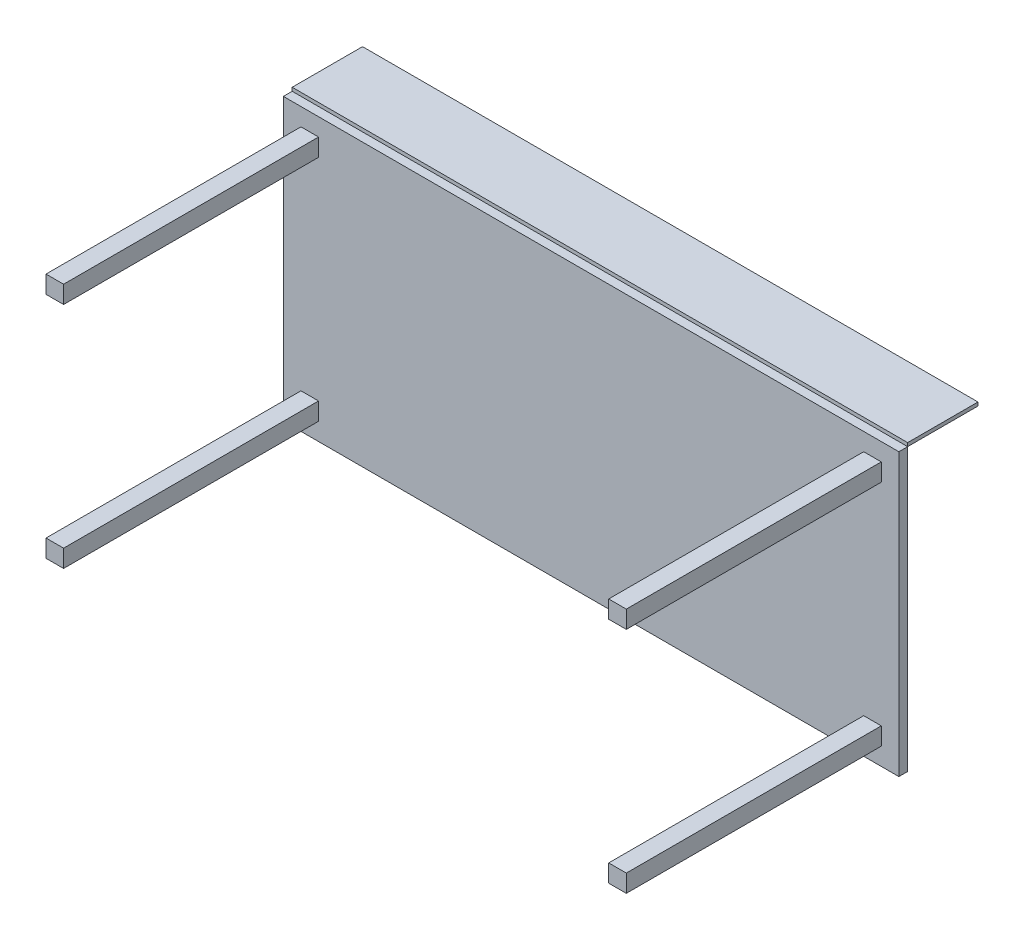
ISO-10303-21;
HEADER;
FILE_DESCRIPTION(('STEP AP214'),'2;1');
FILE_NAME('part.step','',(''),(''),'','','');
FILE_SCHEMA(('AUTOMOTIVE_DESIGN { 1 0 10303 214 1 1 1 1 }'));
ENDSEC;
DATA;
#1=APPLICATION_CONTEXT('core data for automotive mechanical design processes');
#2=APPLICATION_PROTOCOL_DEFINITION('international standard','automotive_design',2000,#1);
#3=PRODUCT_CONTEXT('',#1,'mechanical');
#4=PRODUCT('Part','Part','',(#3));
#5=PRODUCT_RELATED_PRODUCT_CATEGORY('part','',(#4));
#6=PRODUCT_DEFINITION_FORMATION('','',#4);
#7=PRODUCT_DEFINITION_CONTEXT('part definition',#1,'design');
#8=PRODUCT_DEFINITION('design','',#6,#7);
#9=PRODUCT_DEFINITION_SHAPE('','',#8);
#10=(LENGTH_UNIT() NAMED_UNIT(*) SI_UNIT(.MILLI.,.METRE.));
#11=(NAMED_UNIT(*) PLANE_ANGLE_UNIT() SI_UNIT($,.RADIAN.));
#12=(NAMED_UNIT(*) SI_UNIT($,.STERADIAN.) SOLID_ANGLE_UNIT());
#13=UNCERTAINTY_MEASURE_WITH_UNIT(LENGTH_MEASURE(1.E-05),#10,'distance_accuracy_value','');
#14=(GEOMETRIC_REPRESENTATION_CONTEXT(3) GLOBAL_UNCERTAINTY_ASSIGNED_CONTEXT((#13)) GLOBAL_UNIT_ASSIGNED_CONTEXT((#10,
#11,#12)) REPRESENTATION_CONTEXT('',''));
#15=CARTESIAN_POINT('',(0.,0.,0.));
#16=DIRECTION('',(0.,0.,1.));
#17=DIRECTION('',(1.,0.,0.));
#18=AXIS2_PLACEMENT_3D('',#15,#16,#17);
#19=CARTESIAN_POINT('',(778.582583501002,-333.432325570584,0.));
#20=DIRECTION('',(0.,0.,1.));
#21=DIRECTION('',(1.,0.,0.));
#22=AXIS2_PLACEMENT_3D('',#19,#20,#21);
#23=PLANE('',#22);
#24=DIRECTION('',(1.,0.,0.));
#25=VECTOR('',#24,1.);
#26=CARTESIAN_POINT('',(-96.4174164989983,66.5676744294162,0.));
#27=LINE('',#26,#25);
#28=CARTESIAN_POINT('',(-96.4174164989983,66.5676744294162,0.));
#29=VERTEX_POINT('',#28);
#30=CARTESIAN_POINT('',(1653.582583501,66.5676744294162,0.));
#31=VERTEX_POINT('',#30);
#32=EDGE_CURVE('E290',#29,#31,#27,.T.);
#33=ORIENTED_EDGE('',*,*,#32,.T.);
#34=DIRECTION('',(0.,-1.,0.));
#35=VECTOR('',#34,1.);
#36=CARTESIAN_POINT('',(1653.582583501,66.5676744294162,0.));
#37=LINE('',#36,#35);
#38=CARTESIAN_POINT('',(1653.582583501,-733.432325570584,0.));
#39=VERTEX_POINT('',#38);
#40=EDGE_CURVE('E306',#31,#39,#37,.T.);
#41=ORIENTED_EDGE('',*,*,#40,.T.);
#42=DIRECTION('',(-1.,0.,0.));
#43=VECTOR('',#42,1.);
#44=CARTESIAN_POINT('',(1653.582583501,-733.432325570584,0.));
#45=LINE('',#44,#43);
#46=CARTESIAN_POINT('',(-96.4174164989982,-733.432325570584,0.));
#47=VERTEX_POINT('',#46);
#48=EDGE_CURVE('E283',#39,#47,#45,.T.);
#49=ORIENTED_EDGE('',*,*,#48,.T.);
#50=DIRECTION('',(0.,1.,0.));
#51=VECTOR('',#50,1.);
#52=CARTESIAN_POINT('',(-96.4174164989982,-733.432325570584,0.));
#53=LINE('',#52,#51);
#54=EDGE_CURVE('E28',#47,#29,#53,.T.);
#55=ORIENTED_EDGE('',*,*,#54,.T.);
#56=EDGE_LOOP('',(#33,#41,#49,#55));
#57=FACE_BOUND('',#56,.T.);
#58=ADVANCED_FACE('F17',(#57),#23,.F.);
#59=CARTESIAN_POINT('',(778.582583501002,-333.432325570584,25.));
#60=DIRECTION('',(0.,0.,1.));
#61=DIRECTION('',(1.,0.,0.));
#62=AXIS2_PLACEMENT_3D('',#59,#60,#61);
#63=PLANE('',#62);
#64=DIRECTION('',(0.,-1.,0.));
#65=VECTOR('',#64,1.);
#66=CARTESIAN_POINT('',(3.58258350100171,16.5676744294162,25.));
#67=LINE('',#66,#65);
#68=CARTESIAN_POINT('',(3.58258350100169,16.5676744294162,25.));
#69=VERTEX_POINT('',#68);
#70=CARTESIAN_POINT('',(3.5825835010017,-33.4323255705838,25.));
#71=VERTEX_POINT('',#70);
#72=EDGE_CURVE('E263',#69,#71,#67,.T.);
#73=ORIENTED_EDGE('',*,*,#72,.T.);
#74=DIRECTION('',(-1.,0.,0.));
#75=VECTOR('',#74,1.);
#76=CARTESIAN_POINT('',(3.5825835010017,-33.4323255705838,25.));
#77=LINE('',#76,#75);
#78=CARTESIAN_POINT('',(-46.4174164989983,-33.4323255705838,25.));
#79=VERTEX_POINT('',#78);
#80=EDGE_CURVE('E396',#71,#79,#77,.T.);
#81=ORIENTED_EDGE('',*,*,#80,.T.);
#82=DIRECTION('',(0.,1.,0.));
#83=VECTOR('',#82,1.);
#84=CARTESIAN_POINT('',(-46.4174164989983,-33.4323255705838,25.));
#85=LINE('',#84,#83);
#86=CARTESIAN_POINT('',(-46.4174164989983,16.5676744294162,25.));
#87=VERTEX_POINT('',#86);
#88=EDGE_CURVE('E278',#79,#87,#85,.T.);
#89=ORIENTED_EDGE('',*,*,#88,.T.);
#90=DIRECTION('',(1.,0.,0.));
#91=VECTOR('',#90,1.);
#92=CARTESIAN_POINT('',(-46.4174164989983,16.5676744294162,25.));
#93=LINE('',#92,#91);
#94=EDGE_CURVE('E277',#87,#69,#93,.T.);
#95=ORIENTED_EDGE('',*,*,#94,.T.);
#96=EDGE_LOOP('',(#73,#81,#89,#95));
#97=FACE_BOUND('',#96,.T.);
#98=DIRECTION('',(0.,-1.,0.));
#99=VECTOR('',#98,1.);
#100=CARTESIAN_POINT('',(1603.582583501,16.5676744294162,25.));
#101=LINE('',#100,#99);
#102=CARTESIAN_POINT('',(1603.582583501,16.5676744294162,25.));
#103=VERTEX_POINT('',#102);
#104=CARTESIAN_POINT('',(1603.582583501,-33.4323255705838,25.));
#105=VERTEX_POINT('',#104);
#106=EDGE_CURVE('E261',#103,#105,#101,.T.);
#107=ORIENTED_EDGE('',*,*,#106,.T.);
#108=DIRECTION('',(-1.,0.,0.));
#109=VECTOR('',#108,1.);
#110=CARTESIAN_POINT('',(1603.582583501,-33.4323255705838,25.));
#111=LINE('',#110,#109);
#112=CARTESIAN_POINT('',(1553.582583501,-33.4323255705838,25.));
#113=VERTEX_POINT('',#112);
#114=EDGE_CURVE('E339',#105,#113,#111,.T.);
#115=ORIENTED_EDGE('',*,*,#114,.T.);
#116=DIRECTION('',(0.,1.,0.));
#117=VECTOR('',#116,1.);
#118=CARTESIAN_POINT('',(1553.582583501,-33.4323255705838,25.));
#119=LINE('',#118,#117);
#120=CARTESIAN_POINT('',(1553.582583501,16.5676744294162,25.));
#121=VERTEX_POINT('',#120);
#122=EDGE_CURVE('E407',#113,#121,#119,.T.);
#123=ORIENTED_EDGE('',*,*,#122,.T.);
#124=DIRECTION('',(1.,0.,0.));
#125=VECTOR('',#124,1.);
#126=CARTESIAN_POINT('',(1553.582583501,16.5676744294162,25.));
#127=LINE('',#126,#125);
#128=EDGE_CURVE('E428',#121,#103,#127,.T.);
#129=ORIENTED_EDGE('',*,*,#128,.T.);
#130=EDGE_LOOP('',(#107,#115,#123,#129));
#131=FACE_BOUND('',#130,.T.);
#132=DIRECTION('',(0.,-1.,0.));
#133=VECTOR('',#132,1.);
#134=CARTESIAN_POINT('',(3.58258350100187,-633.432325570584,25.));
#135=LINE('',#134,#133);
#136=CARTESIAN_POINT('',(3.5825835010018,-633.432325570584,25.));
#137=VERTEX_POINT('',#136);
#138=CARTESIAN_POINT('',(3.5825835010018,-683.432325570584,25.));
#139=VERTEX_POINT('',#138);
#140=EDGE_CURVE('E234',#137,#139,#135,.T.);
#141=ORIENTED_EDGE('',*,*,#140,.T.);
#142=DIRECTION('',(-1.,0.,0.));
#143=VECTOR('',#142,1.);
#144=CARTESIAN_POINT('',(3.5825835010018,-683.432325570584,25.));
#145=LINE('',#144,#143);
#146=CARTESIAN_POINT('',(-46.4174164989982,-683.432325570584,25.));
#147=VERTEX_POINT('',#146);
#148=EDGE_CURVE('E323',#139,#147,#145,.T.);
#149=ORIENTED_EDGE('',*,*,#148,.T.);
#150=DIRECTION('',(0.,1.,0.));
#151=VECTOR('',#150,1.);
#152=CARTESIAN_POINT('',(-46.4174164989981,-683.432325570584,25.));
#153=LINE('',#152,#151);
#154=CARTESIAN_POINT('',(-46.4174164989982,-633.432325570584,25.));
#155=VERTEX_POINT('',#154);
#156=EDGE_CURVE('E226',#147,#155,#153,.T.);
#157=ORIENTED_EDGE('',*,*,#156,.T.);
#158=DIRECTION('',(1.,0.,0.));
#159=VECTOR('',#158,1.);
#160=CARTESIAN_POINT('',(-46.4174164989982,-633.432325570584,25.));
#161=LINE('',#160,#159);
#162=EDGE_CURVE('E225',#155,#137,#161,.T.);
#163=ORIENTED_EDGE('',*,*,#162,.T.);
#164=EDGE_LOOP('',(#141,#149,#157,#163));
#165=FACE_BOUND('',#164,.T.);
#166=DIRECTION('',(0.,-1.,0.));
#167=VECTOR('',#166,1.);
#168=CARTESIAN_POINT('',(1603.582583501,-633.432325570584,25.));
#169=LINE('',#168,#167);
#170=CARTESIAN_POINT('',(1603.582583501,-633.432325570584,25.));
#171=VERTEX_POINT('',#170);
#172=CARTESIAN_POINT('',(1603.582583501,-683.432325570584,25.));
#173=VERTEX_POINT('',#172);
#174=EDGE_CURVE('E353',#171,#173,#169,.T.);
#175=ORIENTED_EDGE('',*,*,#174,.T.);
#176=DIRECTION('',(-1.,0.,0.));
#177=VECTOR('',#176,1.);
#178=CARTESIAN_POINT('',(1603.582583501,-683.432325570584,25.));
#179=LINE('',#178,#177);
#180=CARTESIAN_POINT('',(1553.582583501,-683.432325570584,25.));
#181=VERTEX_POINT('',#180);
#182=EDGE_CURVE('E348',#173,#181,#179,.T.);
#183=ORIENTED_EDGE('',*,*,#182,.T.);
#184=DIRECTION('',(0.,1.,0.));
#185=VECTOR('',#184,1.);
#186=CARTESIAN_POINT('',(1553.582583501,-683.432325570584,25.));
#187=LINE('',#186,#185);
#188=CARTESIAN_POINT('',(1553.582583501,-633.432325570584,25.));
#189=VERTEX_POINT('',#188);
#190=EDGE_CURVE('E430',#181,#189,#187,.T.);
#191=ORIENTED_EDGE('',*,*,#190,.T.);
#192=DIRECTION('',(1.,0.,0.));
#193=VECTOR('',#192,1.);
#194=CARTESIAN_POINT('',(1553.582583501,-633.432325570584,25.));
#195=LINE('',#194,#193);
#196=EDGE_CURVE('E243',#189,#171,#195,.T.);
#197=ORIENTED_EDGE('',*,*,#196,.T.);
#198=EDGE_LOOP('',(#175,#183,#191,#197));
#199=FACE_BOUND('',#198,.T.);
#200=DIRECTION('',(0.,-1.,0.));
#201=VECTOR('',#200,1.);
#202=CARTESIAN_POINT('',(1653.582583501,66.5676744294162,25.));
#203=LINE('',#202,#201);
#204=CARTESIAN_POINT('',(1653.582583501,66.5676744294162,25.));
#205=VERTEX_POINT('',#204);
#206=CARTESIAN_POINT('',(1653.582583501,-733.432325570584,25.));
#207=VERTEX_POINT('',#206);
#208=EDGE_CURVE('E359',#205,#207,#203,.T.);
#209=ORIENTED_EDGE('',*,*,#208,.F.);
#210=DIRECTION('',(1.,0.,0.));
#211=VECTOR('',#210,1.);
#212=CARTESIAN_POINT('',(-96.4174164989983,66.5676744294162,25.));
#213=LINE('',#212,#211);
#214=CARTESIAN_POINT('',(-96.4174164989983,66.5676744294162,25.));
#215=VERTEX_POINT('',#214);
#216=EDGE_CURVE('E11',#215,#205,#213,.T.);
#217=ORIENTED_EDGE('',*,*,#216,.F.);
#218=DIRECTION('',(0.,1.,0.));
#219=VECTOR('',#218,1.);
#220=CARTESIAN_POINT('',(-96.4174164989982,-733.432325570584,25.));
#221=LINE('',#220,#219);
#222=CARTESIAN_POINT('',(-96.4174164989982,-733.432325570584,25.));
#223=VERTEX_POINT('',#222);
#224=EDGE_CURVE('E333',#223,#215,#221,.T.);
#225=ORIENTED_EDGE('',*,*,#224,.F.);
#226=DIRECTION('',(-1.,0.,0.));
#227=VECTOR('',#226,1.);
#228=CARTESIAN_POINT('',(1653.582583501,-733.432325570584,25.));
#229=LINE('',#228,#227);
#230=EDGE_CURVE('E284',#207,#223,#229,.T.);
#231=ORIENTED_EDGE('',*,*,#230,.F.);
#232=EDGE_LOOP('',(#209,#217,#225,#231));
#233=FACE_BOUND('',#232,.T.);
#234=ADVANCED_FACE('F503',(#97,#131,#165,#199,#233),#63,.T.);
#235=CARTESIAN_POINT('',(-96.4174164989983,66.5676744294162,0.));
#236=DIRECTION('',(0.,1.,0.));
#237=DIRECTION('',(1.,0.,0.));
#238=AXIS2_PLACEMENT_3D('',#235,#236,#237);
#239=PLANE('',#238);
#240=ORIENTED_EDGE('',*,*,#216,.T.);
#241=DIRECTION('',(0.,0.,1.));
#242=VECTOR('',#241,1.);
#243=CARTESIAN_POINT('',(1653.582583501,66.5676744294162,0.));
#244=LINE('',#243,#242);
#245=EDGE_CURVE('E310',#31,#205,#244,.T.);
#246=ORIENTED_EDGE('',*,*,#245,.F.);
#247=DIRECTION('',(1.,0.,0.));
#248=VECTOR('',#247,1.);
#249=CARTESIAN_POINT('',(-96.4174164989983,66.5676744294162,0.));
#250=LINE('',#249,#248);
#251=EDGE_CURVE('E295',#29,#31,#250,.T.);
#252=ORIENTED_EDGE('',*,*,#251,.F.);
#253=DIRECTION('',(0.,0.,1.));
#254=VECTOR('',#253,1.);
#255=CARTESIAN_POINT('',(-96.4174164989983,66.5676744294162,0.));
#256=LINE('',#255,#254);
#257=EDGE_CURVE('E330',#29,#215,#256,.T.);
#258=ORIENTED_EDGE('',*,*,#257,.T.);
#259=EDGE_LOOP('',(#240,#246,#252,#258));
#260=FACE_BOUND('',#259,.T.);
#261=ADVANCED_FACE('F527',(#260),#239,.T.);
#262=CARTESIAN_POINT('',(-96.4174164989982,-733.432325570584,0.));
#263=DIRECTION('',(-1.,0.,0.));
#264=DIRECTION('',(0.,0.,1.));
#265=AXIS2_PLACEMENT_3D('',#262,#263,#264);
#266=PLANE('',#265);
#267=ORIENTED_EDGE('',*,*,#224,.T.);
#268=ORIENTED_EDGE('',*,*,#257,.F.);
#269=ORIENTED_EDGE('',*,*,#54,.F.);
#270=DIRECTION('',(0.,0.,1.));
#271=VECTOR('',#270,1.);
#272=CARTESIAN_POINT('',(-96.4174164989982,-733.432325570584,0.));
#273=LINE('',#272,#271);
#274=EDGE_CURVE('E279',#47,#223,#273,.T.);
#275=ORIENTED_EDGE('',*,*,#274,.T.);
#276=EDGE_LOOP('',(#267,#268,#269,#275));
#277=FACE_BOUND('',#276,.T.);
#278=ADVANCED_FACE('F571',(#277),#266,.T.);
#279=CARTESIAN_POINT('',(1653.582583501,-733.432325570584,0.));
#280=DIRECTION('',(0.,-1.,0.));
#281=DIRECTION('',(0.,0.,-1.));
#282=AXIS2_PLACEMENT_3D('',#279,#280,#281);
#283=PLANE('',#282);
#284=ORIENTED_EDGE('',*,*,#230,.T.);
#285=ORIENTED_EDGE('',*,*,#274,.F.);
#286=ORIENTED_EDGE('',*,*,#48,.F.);
#287=DIRECTION('',(0.,0.,1.));
#288=VECTOR('',#287,1.);
#289=CARTESIAN_POINT('',(1653.582583501,-733.432325570584,0.));
#290=LINE('',#289,#288);
#291=EDGE_CURVE('E311',#39,#207,#290,.T.);
#292=ORIENTED_EDGE('',*,*,#291,.T.);
#293=EDGE_LOOP('',(#284,#285,#286,#292));
#294=FACE_BOUND('',#293,.T.);
#295=ADVANCED_FACE('F568',(#294),#283,.T.);
#296=CARTESIAN_POINT('',(1653.582583501,66.5676744294162,0.));
#297=DIRECTION('',(1.,0.,0.));
#298=DIRECTION('',(0.,1.,0.));
#299=AXIS2_PLACEMENT_3D('',#296,#297,#298);
#300=PLANE('',#299);
#301=ORIENTED_EDGE('',*,*,#208,.T.);
#302=ORIENTED_EDGE('',*,*,#291,.F.);
#303=ORIENTED_EDGE('',*,*,#40,.F.);
#304=ORIENTED_EDGE('',*,*,#245,.T.);
#305=EDGE_LOOP('',(#301,#302,#303,#304));
#306=FACE_BOUND('',#305,.T.);
#307=ADVANCED_FACE('F551',(#306),#300,.T.);
#308=CARTESIAN_POINT('',(-21.4174164989983,-8.43232557058378,750.));
#309=DIRECTION('',(0.,0.,1.));
#310=DIRECTION('',(1.,0.,0.));
#311=AXIS2_PLACEMENT_3D('',#308,#309,#310);
#312=PLANE('',#311);
#313=DIRECTION('',(0.,-1.,0.));
#314=VECTOR('',#313,1.);
#315=CARTESIAN_POINT('',(3.58258350100169,16.5676744294162,750.));
#316=LINE('',#315,#314);
#317=CARTESIAN_POINT('',(3.58258350100169,16.5676744294162,750.));
#318=VERTEX_POINT('',#317);
#319=CARTESIAN_POINT('',(3.5825835010017,-33.4323255705838,750.));
#320=VERTEX_POINT('',#319);
#321=EDGE_CURVE('E343',#318,#320,#316,.T.);
#322=ORIENTED_EDGE('',*,*,#321,.F.);
#323=DIRECTION('',(1.,0.,0.));
#324=VECTOR('',#323,1.);
#325=CARTESIAN_POINT('',(-46.4174164989983,16.5676744294162,750.));
#326=LINE('',#325,#324);
#327=CARTESIAN_POINT('',(-46.4174164989983,16.5676744294162,750.));
#328=VERTEX_POINT('',#327);
#329=EDGE_CURVE('E274',#328,#318,#326,.T.);
#330=ORIENTED_EDGE('',*,*,#329,.F.);
#331=DIRECTION('',(0.,1.,0.));
#332=VECTOR('',#331,1.);
#333=CARTESIAN_POINT('',(-46.4174164989983,-33.4323255705838,750.));
#334=LINE('',#333,#332);
#335=CARTESIAN_POINT('',(-46.4174164989983,-33.4323255705838,750.));
#336=VERTEX_POINT('',#335);
#337=EDGE_CURVE('E400',#336,#328,#334,.T.);
#338=ORIENTED_EDGE('',*,*,#337,.F.);
#339=DIRECTION('',(-1.,0.,0.));
#340=VECTOR('',#339,1.);
#341=CARTESIAN_POINT('',(3.5825835010017,-33.4323255705838,750.));
#342=LINE('',#341,#340);
#343=EDGE_CURVE('E305',#320,#336,#342,.T.);
#344=ORIENTED_EDGE('',*,*,#343,.F.);
#345=EDGE_LOOP('',(#322,#330,#338,#344));
#346=FACE_BOUND('',#345,.T.);
#347=ADVANCED_FACE('F497',(#346),#312,.T.);
#348=CARTESIAN_POINT('',(-46.4174164989983,16.5676744294162,25.));
#349=DIRECTION('',(0.,1.,0.));
#350=DIRECTION('',(1.,0.,0.));
#351=AXIS2_PLACEMENT_3D('',#348,#349,#350);
#352=PLANE('',#351);
#353=ORIENTED_EDGE('',*,*,#329,.T.);
#354=DIRECTION('',(0.,0.,1.));
#355=VECTOR('',#354,1.);
#356=CARTESIAN_POINT('',(3.58258350100169,16.5676744294162,25.));
#357=LINE('',#356,#355);
#358=EDGE_CURVE('E266',#69,#318,#357,.T.);
#359=ORIENTED_EDGE('',*,*,#358,.F.);
#360=ORIENTED_EDGE('',*,*,#94,.F.);
#361=DIRECTION('',(0.,0.,1.));
#362=VECTOR('',#361,1.);
#363=CARTESIAN_POINT('',(-46.4174164989983,16.5676744294162,25.));
#364=LINE('',#363,#362);
#365=EDGE_CURVE('E387',#87,#328,#364,.T.);
#366=ORIENTED_EDGE('',*,*,#365,.T.);
#367=EDGE_LOOP('',(#353,#359,#360,#366));
#368=FACE_BOUND('',#367,.T.);
#369=ADVANCED_FACE('F500',(#368),#352,.T.);
#370=CARTESIAN_POINT('',(-46.4174164989983,-33.4323255705838,25.));
#371=DIRECTION('',(-1.,0.,0.));
#372=DIRECTION('',(0.,0.,1.));
#373=AXIS2_PLACEMENT_3D('',#370,#371,#372);
#374=PLANE('',#373);
#375=ORIENTED_EDGE('',*,*,#337,.T.);
#376=ORIENTED_EDGE('',*,*,#365,.F.);
#377=ORIENTED_EDGE('',*,*,#88,.F.);
#378=DIRECTION('',(0.,0.,1.));
#379=VECTOR('',#378,1.);
#380=CARTESIAN_POINT('',(-46.4174164989983,-33.4323255705838,25.));
#381=LINE('',#380,#379);
#382=EDGE_CURVE('E380',#79,#336,#381,.T.);
#383=ORIENTED_EDGE('',*,*,#382,.T.);
#384=EDGE_LOOP('',(#375,#376,#377,#383));
#385=FACE_BOUND('',#384,.T.);
#386=ADVANCED_FACE('F490',(#385),#374,.T.);
#387=CARTESIAN_POINT('',(3.5825835010017,-33.4323255705838,25.));
#388=DIRECTION('',(0.,-1.,0.));
#389=DIRECTION('',(0.,0.,-1.));
#390=AXIS2_PLACEMENT_3D('',#387,#388,#389);
#391=PLANE('',#390);
#392=ORIENTED_EDGE('',*,*,#343,.T.);
#393=ORIENTED_EDGE('',*,*,#382,.F.);
#394=ORIENTED_EDGE('',*,*,#80,.F.);
#395=DIRECTION('',(0.,0.,1.));
#396=VECTOR('',#395,1.);
#397=CARTESIAN_POINT('',(3.5825835010017,-33.4323255705838,25.));
#398=LINE('',#397,#396);
#399=EDGE_CURVE('E267',#71,#320,#398,.T.);
#400=ORIENTED_EDGE('',*,*,#399,.T.);
#401=EDGE_LOOP('',(#392,#393,#394,#400));
#402=FACE_BOUND('',#401,.T.);
#403=ADVANCED_FACE('F493',(#402),#391,.T.);
#404=CARTESIAN_POINT('',(3.58258350100169,16.5676744294162,25.));
#405=DIRECTION('',(1.,0.,0.));
#406=DIRECTION('',(0.,1.,0.));
#407=AXIS2_PLACEMENT_3D('',#404,#405,#406);
#408=PLANE('',#407);
#409=ORIENTED_EDGE('',*,*,#321,.T.);
#410=ORIENTED_EDGE('',*,*,#399,.F.);
#411=ORIENTED_EDGE('',*,*,#72,.F.);
#412=ORIENTED_EDGE('',*,*,#358,.T.);
#413=EDGE_LOOP('',(#409,#410,#411,#412));
#414=FACE_BOUND('',#413,.T.);
#415=ADVANCED_FACE('F506',(#414),#408,.T.);
#416=CARTESIAN_POINT('',(1578.582583501,-8.43232557058378,750.));
#417=DIRECTION('',(0.,0.,1.));
#418=DIRECTION('',(1.,0.,0.));
#419=AXIS2_PLACEMENT_3D('',#416,#417,#418);
#420=PLANE('',#419);
#421=DIRECTION('',(0.,-1.,0.));
#422=VECTOR('',#421,1.);
#423=CARTESIAN_POINT('',(1603.582583501,16.5676744294162,750.));
#424=LINE('',#423,#422);
#425=CARTESIAN_POINT('',(1603.582583501,16.5676744294162,750.));
#426=VERTEX_POINT('',#425);
#427=CARTESIAN_POINT('',(1603.582583501,-33.4323255705838,750.));
#428=VERTEX_POINT('',#427);
#429=EDGE_CURVE('E262',#426,#428,#424,.T.);
#430=ORIENTED_EDGE('',*,*,#429,.F.);
#431=DIRECTION('',(1.,0.,0.));
#432=VECTOR('',#431,1.);
#433=CARTESIAN_POINT('',(1553.582583501,16.5676744294162,750.));
#434=LINE('',#433,#432);
#435=CARTESIAN_POINT('',(1553.582583501,16.5676744294162,750.));
#436=VERTEX_POINT('',#435);
#437=EDGE_CURVE('E410',#436,#426,#434,.T.);
#438=ORIENTED_EDGE('',*,*,#437,.F.);
#439=DIRECTION('',(0.,1.,0.));
#440=VECTOR('',#439,1.);
#441=CARTESIAN_POINT('',(1553.582583501,-33.4323255705838,750.));
#442=LINE('',#441,#440);
#443=CARTESIAN_POINT('',(1553.582583501,-33.4323255705838,750.));
#444=VERTEX_POINT('',#443);
#445=EDGE_CURVE('E334',#444,#436,#442,.T.);
#446=ORIENTED_EDGE('',*,*,#445,.F.);
#447=DIRECTION('',(-1.,0.,0.));
#448=VECTOR('',#447,1.);
#449=CARTESIAN_POINT('',(1603.582583501,-33.4323255705838,750.));
#450=LINE('',#449,#448);
#451=EDGE_CURVE('E367',#428,#444,#450,.T.);
#452=ORIENTED_EDGE('',*,*,#451,.F.);
#453=EDGE_LOOP('',(#430,#438,#446,#452));
#454=FACE_BOUND('',#453,.T.);
#455=ADVANCED_FACE('F508',(#454),#420,.T.);
#456=CARTESIAN_POINT('',(1553.582583501,16.5676744294162,25.));
#457=DIRECTION('',(0.,1.,0.));
#458=DIRECTION('',(1.,0.,0.));
#459=AXIS2_PLACEMENT_3D('',#456,#457,#458);
#460=PLANE('',#459);
#461=ORIENTED_EDGE('',*,*,#437,.T.);
#462=DIRECTION('',(0.,0.,1.));
#463=VECTOR('',#462,1.);
#464=CARTESIAN_POINT('',(1603.582583501,16.5676744294162,25.));
#465=LINE('',#464,#463);
#466=EDGE_CURVE('E21',#103,#426,#465,.T.);
#467=ORIENTED_EDGE('',*,*,#466,.F.);
#468=ORIENTED_EDGE('',*,*,#128,.F.);
#469=DIRECTION('',(0.,0.,1.));
#470=VECTOR('',#469,1.);
#471=CARTESIAN_POINT('',(1553.582583501,16.5676744294162,25.));
#472=LINE('',#471,#470);
#473=EDGE_CURVE('E338',#121,#436,#472,.T.);
#474=ORIENTED_EDGE('',*,*,#473,.T.);
#475=EDGE_LOOP('',(#461,#467,#468,#474));
#476=FACE_BOUND('',#475,.T.);
#477=ADVANCED_FACE('F515',(#476),#460,.T.);
#478=CARTESIAN_POINT('',(1553.582583501,-33.4323255705838,25.));
#479=DIRECTION('',(-1.,0.,0.));
#480=DIRECTION('',(0.,0.,1.));
#481=AXIS2_PLACEMENT_3D('',#478,#479,#480);
#482=PLANE('',#481);
#483=ORIENTED_EDGE('',*,*,#445,.T.);
#484=ORIENTED_EDGE('',*,*,#473,.F.);
#485=ORIENTED_EDGE('',*,*,#122,.F.);
#486=DIRECTION('',(0.,0.,1.));
#487=VECTOR('',#486,1.);
#488=CARTESIAN_POINT('',(1553.582583501,-33.4323255705838,25.));
#489=LINE('',#488,#487);
#490=EDGE_CURVE('E363',#113,#444,#489,.T.);
#491=ORIENTED_EDGE('',*,*,#490,.T.);
#492=EDGE_LOOP('',(#483,#484,#485,#491));
#493=FACE_BOUND('',#492,.T.);
#494=ADVANCED_FACE('F19',(#493),#482,.T.);
#495=CARTESIAN_POINT('',(1603.582583501,-33.4323255705838,25.));
#496=DIRECTION('',(0.,-1.,0.));
#497=DIRECTION('',(0.,0.,-1.));
#498=AXIS2_PLACEMENT_3D('',#495,#496,#497);
#499=PLANE('',#498);
#500=ORIENTED_EDGE('',*,*,#451,.T.);
#501=ORIENTED_EDGE('',*,*,#490,.F.);
#502=ORIENTED_EDGE('',*,*,#114,.F.);
#503=DIRECTION('',(0.,0.,1.));
#504=VECTOR('',#503,1.);
#505=CARTESIAN_POINT('',(1603.582583501,-33.4323255705838,25.));
#506=LINE('',#505,#504);
#507=EDGE_CURVE('E257',#105,#428,#506,.T.);
#508=ORIENTED_EDGE('',*,*,#507,.T.);
#509=EDGE_LOOP('',(#500,#501,#502,#508));
#510=FACE_BOUND('',#509,.T.);
#511=ADVANCED_FACE('F566',(#510),#499,.T.);
#512=CARTESIAN_POINT('',(1603.582583501,16.5676744294162,25.));
#513=DIRECTION('',(1.,0.,0.));
#514=DIRECTION('',(0.,1.,0.));
#515=AXIS2_PLACEMENT_3D('',#512,#513,#514);
#516=PLANE('',#515);
#517=ORIENTED_EDGE('',*,*,#429,.T.);
#518=ORIENTED_EDGE('',*,*,#507,.F.);
#519=ORIENTED_EDGE('',*,*,#106,.F.);
#520=ORIENTED_EDGE('',*,*,#466,.T.);
#521=EDGE_LOOP('',(#517,#518,#519,#520));
#522=FACE_BOUND('',#521,.T.);
#523=ADVANCED_FACE('F563',(#522),#516,.T.);
#524=CARTESIAN_POINT('',(-21.4174164989982,-658.432325570584,750.));
#525=DIRECTION('',(0.,0.,1.));
#526=DIRECTION('',(1.,0.,0.));
#527=AXIS2_PLACEMENT_3D('',#524,#525,#526);
#528=PLANE('',#527);
#529=DIRECTION('',(0.,-1.,0.));
#530=VECTOR('',#529,1.);
#531=CARTESIAN_POINT('',(3.5825835010018,-633.432325570584,750.));
#532=LINE('',#531,#530);
#533=CARTESIAN_POINT('',(3.5825835010018,-633.432325570584,750.));
#534=VERTEX_POINT('',#533);
#535=CARTESIAN_POINT('',(3.5825835010018,-683.432325570584,750.));
#536=VERTEX_POINT('',#535);
#537=EDGE_CURVE('E232',#534,#536,#532,.T.);
#538=ORIENTED_EDGE('',*,*,#537,.F.);
#539=DIRECTION('',(1.,0.,0.));
#540=VECTOR('',#539,1.);
#541=CARTESIAN_POINT('',(-46.4174164989982,-633.432325570584,750.));
#542=LINE('',#541,#540);
#543=CARTESIAN_POINT('',(-46.4174164989982,-633.432325570584,750.));
#544=VERTEX_POINT('',#543);
#545=EDGE_CURVE('E214',#544,#534,#542,.T.);
#546=ORIENTED_EDGE('',*,*,#545,.F.);
#547=DIRECTION('',(0.,1.,0.));
#548=VECTOR('',#547,1.);
#549=CARTESIAN_POINT('',(-46.4174164989982,-683.432325570584,750.));
#550=LINE('',#549,#548);
#551=CARTESIAN_POINT('',(-46.4174164989982,-683.432325570584,750.));
#552=VERTEX_POINT('',#551);
#553=EDGE_CURVE('E326',#552,#544,#550,.T.);
#554=ORIENTED_EDGE('',*,*,#553,.F.);
#555=DIRECTION('',(-1.,0.,0.));
#556=VECTOR('',#555,1.);
#557=CARTESIAN_POINT('',(3.5825835010018,-683.432325570584,750.));
#558=LINE('',#557,#556);
#559=EDGE_CURVE('E236',#536,#552,#558,.T.);
#560=ORIENTED_EDGE('',*,*,#559,.F.);
#561=EDGE_LOOP('',(#538,#546,#554,#560));
#562=FACE_BOUND('',#561,.T.);
#563=ADVANCED_FACE('F238',(#562),#528,.T.);
#564=CARTESIAN_POINT('',(-46.4174164989982,-633.432325570584,25.));
#565=DIRECTION('',(0.,1.,0.));
#566=DIRECTION('',(1.,0.,0.));
#567=AXIS2_PLACEMENT_3D('',#564,#565,#566);
#568=PLANE('',#567);
#569=ORIENTED_EDGE('',*,*,#545,.T.);
#570=DIRECTION('',(0.,0.,1.));
#571=VECTOR('',#570,1.);
#572=CARTESIAN_POINT('',(3.5825835010018,-633.432325570584,25.));
#573=LINE('',#572,#571);
#574=EDGE_CURVE('E217',#137,#534,#573,.T.);
#575=ORIENTED_EDGE('',*,*,#574,.F.);
#576=ORIENTED_EDGE('',*,*,#162,.F.);
#577=DIRECTION('',(0.,0.,1.));
#578=VECTOR('',#577,1.);
#579=CARTESIAN_POINT('',(-46.4174164989982,-633.432325570584,25.));
#580=LINE('',#579,#578);
#581=EDGE_CURVE('E220',#155,#544,#580,.T.);
#582=ORIENTED_EDGE('',*,*,#581,.T.);
#583=EDGE_LOOP('',(#569,#575,#576,#582));
#584=FACE_BOUND('',#583,.T.);
#585=ADVANCED_FACE('F216',(#584),#568,.T.);
#586=CARTESIAN_POINT('',(-46.4174164989982,-683.432325570584,25.));
#587=DIRECTION('',(-1.,0.,0.));
#588=DIRECTION('',(0.,0.,1.));
#589=AXIS2_PLACEMENT_3D('',#586,#587,#588);
#590=PLANE('',#589);
#591=ORIENTED_EDGE('',*,*,#553,.T.);
#592=ORIENTED_EDGE('',*,*,#581,.F.);
#593=ORIENTED_EDGE('',*,*,#156,.F.);
#594=DIRECTION('',(0.,0.,1.));
#595=VECTOR('',#594,1.);
#596=CARTESIAN_POINT('',(-46.4174164989982,-683.432325570584,25.));
#597=LINE('',#596,#595);
#598=EDGE_CURVE('E319',#147,#552,#597,.T.);
#599=ORIENTED_EDGE('',*,*,#598,.T.);
#600=EDGE_LOOP('',(#591,#592,#593,#599));
#601=FACE_BOUND('',#600,.T.);
#602=ADVANCED_FACE('F585',(#601),#590,.T.);
#603=CARTESIAN_POINT('',(3.5825835010018,-683.432325570584,25.));
#604=DIRECTION('',(0.,-1.,0.));
#605=DIRECTION('',(0.,0.,-1.));
#606=AXIS2_PLACEMENT_3D('',#603,#604,#605);
#607=PLANE('',#606);
#608=ORIENTED_EDGE('',*,*,#559,.T.);
#609=ORIENTED_EDGE('',*,*,#598,.F.);
#610=ORIENTED_EDGE('',*,*,#148,.F.);
#611=DIRECTION('',(0.,0.,1.));
#612=VECTOR('',#611,1.);
#613=CARTESIAN_POINT('',(3.5825835010018,-683.432325570584,25.));
#614=LINE('',#613,#612);
#615=EDGE_CURVE('E242',#139,#536,#614,.T.);
#616=ORIENTED_EDGE('',*,*,#615,.T.);
#617=EDGE_LOOP('',(#608,#609,#610,#616));
#618=FACE_BOUND('',#617,.T.);
#619=ADVANCED_FACE('F559',(#618),#607,.T.);
#620=CARTESIAN_POINT('',(3.5825835010018,-633.432325570584,25.));
#621=DIRECTION('',(1.,0.,0.));
#622=DIRECTION('',(0.,1.,0.));
#623=AXIS2_PLACEMENT_3D('',#620,#621,#622);
#624=PLANE('',#623);
#625=ORIENTED_EDGE('',*,*,#537,.T.);
#626=ORIENTED_EDGE('',*,*,#615,.F.);
#627=ORIENTED_EDGE('',*,*,#140,.F.);
#628=ORIENTED_EDGE('',*,*,#574,.T.);
#629=EDGE_LOOP('',(#625,#626,#627,#628));
#630=FACE_BOUND('',#629,.T.);
#631=ADVANCED_FACE('F230',(#630),#624,.T.);
#632=CARTESIAN_POINT('',(1578.582583501,-658.432325570584,750.));
#633=DIRECTION('',(0.,0.,1.));
#634=DIRECTION('',(1.,0.,0.));
#635=AXIS2_PLACEMENT_3D('',#632,#633,#634);
#636=PLANE('',#635);
#637=DIRECTION('',(0.,-1.,0.));
#638=VECTOR('',#637,1.);
#639=CARTESIAN_POINT('',(1603.582583501,-633.432325570584,750.));
#640=LINE('',#639,#638);
#641=CARTESIAN_POINT('',(1603.582583501,-633.432325570584,750.));
#642=VERTEX_POINT('',#641);
#643=CARTESIAN_POINT('',(1603.582583501,-683.432325570584,750.));
#644=VERTEX_POINT('',#643);
#645=EDGE_CURVE('E294',#642,#644,#640,.T.);
#646=ORIENTED_EDGE('',*,*,#645,.F.);
#647=DIRECTION('',(1.,0.,0.));
#648=VECTOR('',#647,1.);
#649=CARTESIAN_POINT('',(1553.582583501,-633.432325570584,750.));
#650=LINE('',#649,#648);
#651=CARTESIAN_POINT('',(1553.582583501,-633.432325570584,750.));
#652=VERTEX_POINT('',#651);
#653=EDGE_CURVE('E251',#652,#642,#650,.T.);
#654=ORIENTED_EDGE('',*,*,#653,.F.);
#655=DIRECTION('',(0.,1.,0.));
#656=VECTOR('',#655,1.);
#657=CARTESIAN_POINT('',(1553.582583501,-683.432325570584,750.));
#658=LINE('',#657,#656);
#659=CARTESIAN_POINT('',(1553.582583501,-683.432325570584,750.));
#660=VERTEX_POINT('',#659);
#661=EDGE_CURVE('E388',#660,#652,#658,.T.);
#662=ORIENTED_EDGE('',*,*,#661,.F.);
#663=DIRECTION('',(-1.,0.,0.));
#664=VECTOR('',#663,1.);
#665=CARTESIAN_POINT('',(1603.582583501,-683.432325570584,750.));
#666=LINE('',#665,#664);
#667=EDGE_CURVE('E349',#644,#660,#666,.T.);
#668=ORIENTED_EDGE('',*,*,#667,.F.);
#669=EDGE_LOOP('',(#646,#654,#662,#668));
#670=FACE_BOUND('',#669,.T.);
#671=ADVANCED_FACE('F538',(#670),#636,.T.);
#672=CARTESIAN_POINT('',(1553.582583501,-633.432325570584,25.));
#673=DIRECTION('',(0.,1.,0.));
#674=DIRECTION('',(1.,0.,0.));
#675=AXIS2_PLACEMENT_3D('',#672,#673,#674);
#676=PLANE('',#675);
#677=ORIENTED_EDGE('',*,*,#653,.T.);
#678=DIRECTION('',(0.,0.,1.));
#679=VECTOR('',#678,1.);
#680=CARTESIAN_POINT('',(1603.582583501,-633.432325570584,25.));
#681=LINE('',#680,#679);
#682=EDGE_CURVE('E357',#171,#642,#681,.T.);
#683=ORIENTED_EDGE('',*,*,#682,.F.);
#684=ORIENTED_EDGE('',*,*,#196,.F.);
#685=DIRECTION('',(0.,0.,1.));
#686=VECTOR('',#685,1.);
#687=CARTESIAN_POINT('',(1553.582583501,-633.432325570584,25.));
#688=LINE('',#687,#686);
#689=EDGE_CURVE('E392',#189,#652,#688,.T.);
#690=ORIENTED_EDGE('',*,*,#689,.T.);
#691=EDGE_LOOP('',(#677,#683,#684,#690));
#692=FACE_BOUND('',#691,.T.);
#693=ADVANCED_FACE('F536',(#692),#676,.T.);
#694=CARTESIAN_POINT('',(1553.582583501,-683.432325570584,25.));
#695=DIRECTION('',(-1.,0.,0.));
#696=DIRECTION('',(0.,0.,1.));
#697=AXIS2_PLACEMENT_3D('',#694,#695,#696);
#698=PLANE('',#697);
#699=ORIENTED_EDGE('',*,*,#661,.T.);
#700=ORIENTED_EDGE('',*,*,#689,.F.);
#701=ORIENTED_EDGE('',*,*,#190,.F.);
#702=DIRECTION('',(0.,0.,1.));
#703=VECTOR('',#702,1.);
#704=CARTESIAN_POINT('',(1553.582583501,-683.432325570584,25.));
#705=LINE('',#704,#703);
#706=EDGE_CURVE('E344',#181,#660,#705,.T.);
#707=ORIENTED_EDGE('',*,*,#706,.T.);
#708=EDGE_LOOP('',(#699,#700,#701,#707));
#709=FACE_BOUND('',#708,.T.);
#710=ADVANCED_FACE('F532',(#709),#698,.T.);
#711=CARTESIAN_POINT('',(1603.582583501,-683.432325570584,25.));
#712=DIRECTION('',(0.,-1.,0.));
#713=DIRECTION('',(0.,0.,-1.));
#714=AXIS2_PLACEMENT_3D('',#711,#712,#713);
#715=PLANE('',#714);
#716=ORIENTED_EDGE('',*,*,#667,.T.);
#717=ORIENTED_EDGE('',*,*,#706,.F.);
#718=ORIENTED_EDGE('',*,*,#182,.F.);
#719=DIRECTION('',(0.,0.,1.));
#720=VECTOR('',#719,1.);
#721=CARTESIAN_POINT('',(1603.582583501,-683.432325570584,25.));
#722=LINE('',#721,#720);
#723=EDGE_CURVE('E358',#173,#644,#722,.T.);
#724=ORIENTED_EDGE('',*,*,#723,.T.);
#725=EDGE_LOOP('',(#716,#717,#718,#724));
#726=FACE_BOUND('',#725,.T.);
#727=ADVANCED_FACE('F535',(#726),#715,.T.);
#728=CARTESIAN_POINT('',(1603.582583501,-633.432325570584,25.));
#729=DIRECTION('',(1.,0.,0.));
#730=DIRECTION('',(0.,1.,0.));
#731=AXIS2_PLACEMENT_3D('',#728,#729,#730);
#732=PLANE('',#731);
#733=ORIENTED_EDGE('',*,*,#645,.T.);
#734=ORIENTED_EDGE('',*,*,#723,.F.);
#735=ORIENTED_EDGE('',*,*,#174,.F.);
#736=ORIENTED_EDGE('',*,*,#682,.T.);
#737=EDGE_LOOP('',(#733,#734,#735,#736));
#738=FACE_BOUND('',#737,.T.);
#739=ADVANCED_FACE('F544',(#738),#732,.T.);
#740=CARTESIAN_POINT('',(778.582583501002,76.5676744294162,-100.));
#741=DIRECTION('',(0.,1.,0.));
#742=DIRECTION('',(1.,0.,0.));
#743=AXIS2_PLACEMENT_3D('',#740,#741,#742);
#744=PLANE('',#743);
#745=DIRECTION('',(0.,0.,-1.));
#746=VECTOR('',#745,1.);
#747=CARTESIAN_POINT('',(-96.4174164989983,76.5676744294162,0.));
#748=LINE('',#747,#746);
#749=CARTESIAN_POINT('',(-96.4174164989983,76.5676744294162,0.));
#750=VERTEX_POINT('',#749);
#751=CARTESIAN_POINT('',(-96.4174164989984,76.5676744294162,-200.));
#752=VERTEX_POINT('',#751);
#753=EDGE_CURVE('E269',#750,#752,#748,.T.);
#754=ORIENTED_EDGE('',*,*,#753,.F.);
#755=DIRECTION('',(-1.,0.,0.));
#756=VECTOR('',#755,1.);
#757=CARTESIAN_POINT('',(1653.582583501,76.5676744294162,0.));
#758=LINE('',#757,#756);
#759=CARTESIAN_POINT('',(1653.582583501,76.5676744294162,0.));
#760=VERTEX_POINT('',#759);
#761=EDGE_CURVE('E452',#760,#750,#758,.T.);
#762=ORIENTED_EDGE('',*,*,#761,.F.);
#763=DIRECTION('',(0.,0.,1.));
#764=VECTOR('',#763,1.);
#765=CARTESIAN_POINT('',(1653.582583501,76.5676744294162,-200.));
#766=LINE('',#765,#764);
#767=CARTESIAN_POINT('',(1653.582583501,76.5676744294162,-200.));
#768=VERTEX_POINT('',#767);
#769=EDGE_CURVE('E288',#768,#760,#766,.T.);
#770=ORIENTED_EDGE('',*,*,#769,.F.);
#771=DIRECTION('',(1.,0.,0.));
#772=VECTOR('',#771,1.);
#773=CARTESIAN_POINT('',(-96.4174164989984,76.5676744294162,-200.));
#774=LINE('',#773,#772);
#775=EDGE_CURVE('E376',#752,#768,#774,.T.);
#776=ORIENTED_EDGE('',*,*,#775,.F.);
#777=EDGE_LOOP('',(#754,#762,#770,#776));
#778=FACE_BOUND('',#777,.T.);
#779=ADVANCED_FACE('F547',(#778),#744,.T.);
#780=CARTESIAN_POINT('',(778.582583501002,66.5676744294162,-100.));
#781=DIRECTION('',(0.,1.,0.));
#782=DIRECTION('',(1.,0.,0.));
#783=AXIS2_PLACEMENT_3D('',#780,#781,#782);
#784=PLANE('',#783);
#785=ORIENTED_EDGE('',*,*,#32,.F.);
#786=DIRECTION('',(0.,0.,1.));
#787=VECTOR('',#786,1.);
#788=CARTESIAN_POINT('',(-96.4174164989984,66.5676744294162,-200.));
#789=LINE('',#788,#787);
#790=CARTESIAN_POINT('',(-96.4174164989984,66.5676744294162,-200.));
#791=VERTEX_POINT('',#790);
#792=EDGE_CURVE('E312',#791,#29,#789,.T.);
#793=ORIENTED_EDGE('',*,*,#792,.F.);
#794=DIRECTION('',(-1.,0.,0.));
#795=VECTOR('',#794,1.);
#796=CARTESIAN_POINT('',(1653.582583501,66.5676744294162,-200.));
#797=LINE('',#796,#795);
#798=CARTESIAN_POINT('',(1653.582583501,66.5676744294162,-200.));
#799=VERTEX_POINT('',#798);
#800=EDGE_CURVE('E285',#799,#791,#797,.T.);
#801=ORIENTED_EDGE('',*,*,#800,.F.);
#802=DIRECTION('',(0.,0.,-1.));
#803=VECTOR('',#802,1.);
#804=CARTESIAN_POINT('',(1653.582583501,66.5676744294162,0.));
#805=LINE('',#804,#803);
#806=EDGE_CURVE('E449',#31,#799,#805,.T.);
#807=ORIENTED_EDGE('',*,*,#806,.F.);
#808=EDGE_LOOP('',(#785,#793,#801,#807));
#809=FACE_BOUND('',#808,.T.);
#810=ADVANCED_FACE('F552',(#809),#784,.F.);
#811=CARTESIAN_POINT('',(1653.582583501,66.5676744294162,0.));
#812=DIRECTION('',(0.,0.,1.));
#813=DIRECTION('',(1.,0.,0.));
#814=AXIS2_PLACEMENT_3D('',#811,#812,#813);
#815=PLANE('',#814);
#816=ORIENTED_EDGE('',*,*,#761,.T.);
#817=DIRECTION('',(0.,1.,0.));
#818=VECTOR('',#817,1.);
#819=CARTESIAN_POINT('',(-96.4174164989983,66.5676744294162,0.));
#820=LINE('',#819,#818);
#821=EDGE_CURVE('E316',#29,#750,#820,.T.);
#822=ORIENTED_EDGE('',*,*,#821,.F.);
#823=ORIENTED_EDGE('',*,*,#251,.T.);
#824=DIRECTION('',(0.,1.,0.));
#825=VECTOR('',#824,1.);
#826=CARTESIAN_POINT('',(1653.582583501,66.5676744294162,0.));
#827=LINE('',#826,#825);
#828=EDGE_CURVE('E255',#31,#760,#827,.T.);
#829=ORIENTED_EDGE('',*,*,#828,.T.);
#830=EDGE_LOOP('',(#816,#822,#823,#829));
#831=FACE_BOUND('',#830,.T.);
#832=ADVANCED_FACE('F555',(#831),#815,.T.);
#833=CARTESIAN_POINT('',(1653.582583501,66.5676744294162,-200.));
#834=DIRECTION('',(1.,0.,0.));
#835=DIRECTION('',(0.,1.,0.));
#836=AXIS2_PLACEMENT_3D('',#833,#834,#835);
#837=PLANE('',#836);
#838=ORIENTED_EDGE('',*,*,#769,.T.);
#839=ORIENTED_EDGE('',*,*,#828,.F.);
#840=ORIENTED_EDGE('',*,*,#806,.T.);
#841=DIRECTION('',(0.,1.,0.));
#842=VECTOR('',#841,1.);
#843=CARTESIAN_POINT('',(1653.582583501,66.5676744294162,-200.));
#844=LINE('',#843,#842);
#845=EDGE_CURVE('E289',#799,#768,#844,.T.);
#846=ORIENTED_EDGE('',*,*,#845,.T.);
#847=EDGE_LOOP('',(#838,#839,#840,#846));
#848=FACE_BOUND('',#847,.T.);
#849=ADVANCED_FACE('F597',(#848),#837,.T.);
#850=CARTESIAN_POINT('',(-96.4174164989984,66.5676744294162,-200.));
#851=DIRECTION('',(0.,0.,-1.));
#852=DIRECTION('',(0.,-1.,0.));
#853=AXIS2_PLACEMENT_3D('',#850,#851,#852);
#854=PLANE('',#853);
#855=ORIENTED_EDGE('',*,*,#775,.T.);
#856=ORIENTED_EDGE('',*,*,#845,.F.);
#857=ORIENTED_EDGE('',*,*,#800,.T.);
#858=DIRECTION('',(0.,1.,0.));
#859=VECTOR('',#858,1.);
#860=CARTESIAN_POINT('',(-96.4174164989984,66.5676744294162,-200.));
#861=LINE('',#860,#859);
#862=EDGE_CURVE('E273',#791,#752,#861,.T.);
#863=ORIENTED_EDGE('',*,*,#862,.T.);
#864=EDGE_LOOP('',(#855,#856,#857,#863));
#865=FACE_BOUND('',#864,.T.);
#866=ADVANCED_FACE('F575',(#865),#854,.T.);
#867=CARTESIAN_POINT('',(-96.4174164989983,66.5676744294162,0.));
#868=DIRECTION('',(-1.,0.,0.));
#869=DIRECTION('',(0.,0.,1.));
#870=AXIS2_PLACEMENT_3D('',#867,#868,#869);
#871=PLANE('',#870);
#872=ORIENTED_EDGE('',*,*,#753,.T.);
#873=ORIENTED_EDGE('',*,*,#862,.F.);
#874=ORIENTED_EDGE('',*,*,#792,.T.);
#875=ORIENTED_EDGE('',*,*,#821,.T.);
#876=EDGE_LOOP('',(#872,#873,#874,#875));
#877=FACE_BOUND('',#876,.T.);
#878=ADVANCED_FACE('F573',(#877),#871,.T.);
#879=CLOSED_SHELL('',(#58,#234,#261,#278,#295,#307,#347,#369,#386,#403,#415,#455,#477,#494,#511,
#523,#563,#585,#602,#619,#631,#671,#693,#710,#727,#739,#779,#810,#832,#849,#866,#878));
#880=MANIFOLD_SOLID_BREP('B1',#879);
#881=ADVANCED_BREP_SHAPE_REPRESENTATION('',(#18,#880),#14);
#882=SHAPE_DEFINITION_REPRESENTATION(#9,#881);
ENDSEC;
END-ISO-10303-21;
